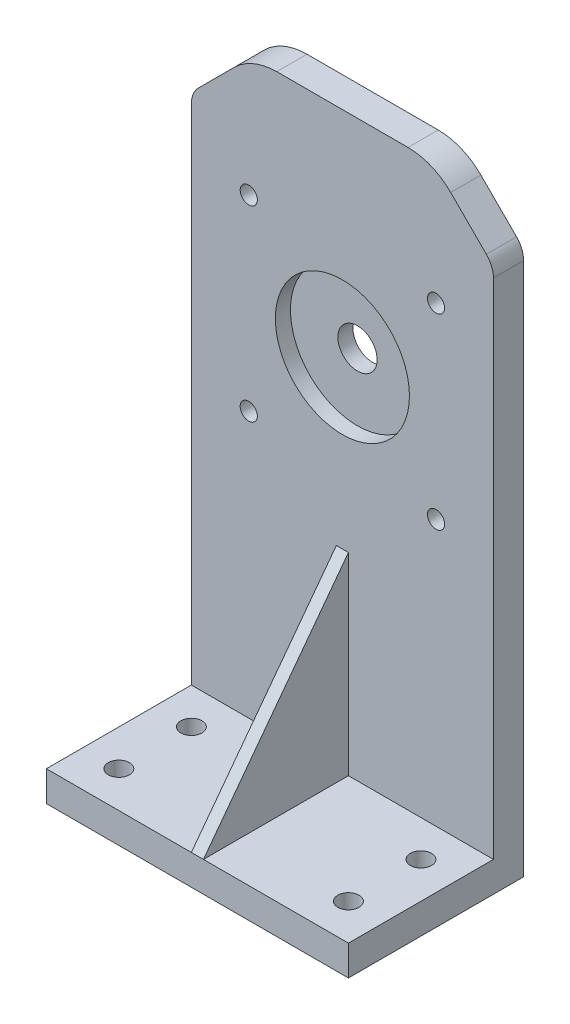
ISO-10303-21;
HEADER;
FILE_DESCRIPTION(('STEP AP214'),'2;1');
FILE_NAME('part.step','',(''),(''),'','','');
FILE_SCHEMA(('AUTOMOTIVE_DESIGN { 1 0 10303 214 1 1 1 1 }'));
ENDSEC;
DATA;
#1=APPLICATION_CONTEXT('core data for automotive mechanical design processes');
#2=APPLICATION_PROTOCOL_DEFINITION('international standard','automotive_design',2000,#1);
#3=PRODUCT_CONTEXT('',#1,'mechanical');
#4=PRODUCT('Part','Part','',(#3));
#5=PRODUCT_RELATED_PRODUCT_CATEGORY('part','',(#4));
#6=PRODUCT_DEFINITION_FORMATION('','',#4);
#7=PRODUCT_DEFINITION_CONTEXT('part definition',#1,'design');
#8=PRODUCT_DEFINITION('design','',#6,#7);
#9=PRODUCT_DEFINITION_SHAPE('','',#8);
#10=(LENGTH_UNIT() NAMED_UNIT(*) SI_UNIT(.MILLI.,.METRE.));
#11=(NAMED_UNIT(*) PLANE_ANGLE_UNIT() SI_UNIT($,.RADIAN.));
#12=(NAMED_UNIT(*) SI_UNIT($,.STERADIAN.) SOLID_ANGLE_UNIT());
#13=UNCERTAINTY_MEASURE_WITH_UNIT(LENGTH_MEASURE(1.E-05),#10,'distance_accuracy_value','');
#14=(GEOMETRIC_REPRESENTATION_CONTEXT(3) GLOBAL_UNCERTAINTY_ASSIGNED_CONTEXT((#13)) GLOBAL_UNIT_ASSIGNED_CONTEXT((#10,
#11,#12)) REPRESENTATION_CONTEXT('',''));
#15=CARTESIAN_POINT('',(0.,0.,0.));
#16=DIRECTION('',(0.,0.,1.));
#17=DIRECTION('',(1.,0.,0.));
#18=AXIS2_PLACEMENT_3D('',#15,#16,#17);
#19=CARTESIAN_POINT('',(0.,5.,0.));
#20=DIRECTION('',(0.,-1.,0.));
#21=DIRECTION('',(0.,0.,-1.));
#22=AXIS2_PLACEMENT_3D('',#19,#20,#21);
#23=PLANE('',#22);
#24=CARTESIAN_POINT('',(19.,5.,-3.5));
#25=DIRECTION('',(0.,1.,0.));
#26=DIRECTION('',(0.,0.,1.));
#27=AXIS2_PLACEMENT_3D('',#24,#25,#26);
#28=CIRCLE('',#27,1.75);
#29=CARTESIAN_POINT('',(19.,5.,-1.75));
#30=VERTEX_POINT('',#29);
#31=EDGE_CURVE('E287',#30,#30,#28,.T.);
#32=ORIENTED_EDGE('',*,*,#31,.F.);
#33=EDGE_LOOP('',(#32));
#34=FACE_BOUND('',#33,.T.);
#35=CARTESIAN_POINT('',(19.,5.,8.5));
#36=DIRECTION('',(0.,1.,0.));
#37=DIRECTION('',(0.,0.,1.));
#38=AXIS2_PLACEMENT_3D('',#35,#36,#37);
#39=CIRCLE('',#38,1.75);
#40=CARTESIAN_POINT('',(19.,5.,10.25));
#41=VERTEX_POINT('',#40);
#42=EDGE_CURVE('E290',#41,#41,#39,.T.);
#43=ORIENTED_EDGE('',*,*,#42,.F.);
#44=EDGE_LOOP('',(#43));
#45=FACE_BOUND('',#44,.T.);
#46=DIRECTION('',(0.,0.,-1.));
#47=VECTOR('',#46,1.);
#48=CARTESIAN_POINT('',(0.999999999999997,5.,-9.5));
#49=LINE('',#48,#47);
#50=CARTESIAN_POINT('',(1.,5.,14.5));
#51=VERTEX_POINT('',#50);
#52=CARTESIAN_POINT('',(0.999999999999997,5.,-9.5));
#53=VERTEX_POINT('',#52);
#54=EDGE_CURVE('E157',#51,#53,#49,.T.);
#55=ORIENTED_EDGE('',*,*,#54,.F.);
#56=DIRECTION('',(1.,0.,0.));
#57=VECTOR('',#56,1.);
#58=CARTESIAN_POINT('',(-25.,5.,14.5));
#59=LINE('',#58,#57);
#60=CARTESIAN_POINT('',(25.,5.,14.5));
#61=VERTEX_POINT('',#60);
#62=EDGE_CURVE('E163',#51,#61,#59,.T.);
#63=ORIENTED_EDGE('',*,*,#62,.T.);
#64=DIRECTION('',(0.,0.,-1.));
#65=VECTOR('',#64,1.);
#66=CARTESIAN_POINT('',(25.,5.,14.5));
#67=LINE('',#66,#65);
#68=CARTESIAN_POINT('',(25.,5.,-9.5));
#69=VERTEX_POINT('',#68);
#70=EDGE_CURVE('E176',#61,#69,#67,.T.);
#71=ORIENTED_EDGE('',*,*,#70,.T.);
#72=DIRECTION('',(1.,0.,0.));
#73=VECTOR('',#72,1.);
#74=CARTESIAN_POINT('',(-25.,5.,-9.5));
#75=LINE('',#74,#73);
#76=EDGE_CURVE('E166',#53,#69,#75,.T.);
#77=ORIENTED_EDGE('',*,*,#76,.F.);
#78=EDGE_LOOP('',(#55,#63,#71,#77));
#79=FACE_BOUND('',#78,.T.);
#80=ADVANCED_FACE('F35',(#34,#45,#79),#23,.F.);
#81=CARTESIAN_POINT('',(-19.,5.,-3.5));
#82=DIRECTION('',(0.,1.,0.));
#83=DIRECTION('',(0.,0.,1.));
#84=AXIS2_PLACEMENT_3D('',#81,#82,#83);
#85=CIRCLE('',#84,1.75);
#86=CARTESIAN_POINT('',(-19.,5.,-1.75));
#87=VERTEX_POINT('',#86);
#88=EDGE_CURVE('E204',#87,#87,#85,.T.);
#89=ORIENTED_EDGE('',*,*,#88,.F.);
#90=EDGE_LOOP('',(#89));
#91=FACE_BOUND('',#90,.T.);
#92=CARTESIAN_POINT('',(-19.,5.,8.5));
#93=DIRECTION('',(0.,1.,0.));
#94=DIRECTION('',(0.,0.,1.));
#95=AXIS2_PLACEMENT_3D('',#92,#93,#94);
#96=CIRCLE('',#95,1.75);
#97=CARTESIAN_POINT('',(-19.,5.,10.25));
#98=VERTEX_POINT('',#97);
#99=EDGE_CURVE('E209',#98,#98,#96,.T.);
#100=ORIENTED_EDGE('',*,*,#99,.F.);
#101=EDGE_LOOP('',(#100));
#102=FACE_BOUND('',#101,.T.);
#103=DIRECTION('',(0.,0.,1.));
#104=VECTOR('',#103,1.);
#105=CARTESIAN_POINT('',(-1.00000000000001,5.,-9.5));
#106=LINE('',#105,#104);
#107=CARTESIAN_POINT('',(-1.,5.,-9.5));
#108=VERTEX_POINT('',#107);
#109=CARTESIAN_POINT('',(-1.,5.,14.5));
#110=VERTEX_POINT('',#109);
#111=EDGE_CURVE('E167',#108,#110,#106,.T.);
#112=ORIENTED_EDGE('',*,*,#111,.F.);
#113=CARTESIAN_POINT('',(-25.,5.,-9.5));
#114=VERTEX_POINT('',#113);
#115=EDGE_CURVE('E336',#114,#108,#75,.T.);
#116=ORIENTED_EDGE('',*,*,#115,.F.);
#117=DIRECTION('',(0.,0.,1.));
#118=VECTOR('',#117,1.);
#119=CARTESIAN_POINT('',(-25.,5.,14.5));
#120=LINE('',#119,#118);
#121=CARTESIAN_POINT('',(-25.,5.,14.5));
#122=VERTEX_POINT('',#121);
#123=EDGE_CURVE('E174',#114,#122,#120,.T.);
#124=ORIENTED_EDGE('',*,*,#123,.T.);
#125=EDGE_CURVE('E173',#122,#110,#59,.T.);
#126=ORIENTED_EDGE('',*,*,#125,.T.);
#127=EDGE_LOOP('',(#112,#116,#124,#126));
#128=FACE_BOUND('',#127,.T.);
#129=ADVANCED_FACE('F273',(#91,#102,#128),#23,.F.);
#130=CARTESIAN_POINT('',(-25.,100.,-9.5));
#131=DIRECTION('',(0.,0.,-1.));
#132=DIRECTION('',(-1.,0.,0.));
#133=AXIS2_PLACEMENT_3D('',#130,#131,#132);
#134=PLANE('',#133);
#135=DIRECTION('',(-0.707106781186547,-0.707106781186549,0.));
#136=VECTOR('',#135,1.);
#137=CARTESIAN_POINT('',(-15.,100.,-9.5));
#138=LINE('',#137,#136);
#139=CARTESIAN_POINT('',(-17.9289321881345,97.0710678118655,-9.5));
#140=VERTEX_POINT('',#139);
#141=CARTESIAN_POINT('',(-23.8284271247462,91.1715728752538,-9.5));
#142=VERTEX_POINT('',#141);
#143=EDGE_CURVE('E216',#140,#142,#138,.T.);
#144=ORIENTED_EDGE('',*,*,#143,.T.);
#145=CARTESIAN_POINT('',(-21.,88.3431457505076,-9.5));
#146=DIRECTION('',(0.,0.,-1.));
#147=DIRECTION('',(-1.,0.,0.));
#148=AXIS2_PLACEMENT_3D('',#145,#146,#147);
#149=CIRCLE('',#148,4.);
#150=CARTESIAN_POINT('',(-25.,88.3431457505076,-9.5));
#151=VERTEX_POINT('',#150);
#152=EDGE_CURVE('E11',#142,#151,#149,.F.);
#153=ORIENTED_EDGE('',*,*,#152,.T.);
#154=DIRECTION('',(0.,-1.,0.));
#155=VECTOR('',#154,1.);
#156=CARTESIAN_POINT('',(-25.,100.,-9.5));
#157=LINE('',#156,#155);
#158=EDGE_CURVE('E184',#151,#114,#157,.T.);
#159=ORIENTED_EDGE('',*,*,#158,.T.);
#160=ORIENTED_EDGE('',*,*,#115,.T.);
#161=DIRECTION('',(0.,-1.,0.));
#162=VECTOR('',#161,1.);
#163=CARTESIAN_POINT('',(-1.00000000000001,37.,-9.5));
#164=LINE('',#163,#162);
#165=CARTESIAN_POINT('',(-1.00000000000001,37.,-9.5));
#166=VERTEX_POINT('',#165);
#167=EDGE_CURVE('E280',#166,#108,#164,.T.);
#168=ORIENTED_EDGE('',*,*,#167,.F.);
#169=DIRECTION('',(-1.,0.,0.));
#170=VECTOR('',#169,1.);
#171=CARTESIAN_POINT('',(0.999999999999997,37.,-9.5));
#172=LINE('',#171,#170);
#173=CARTESIAN_POINT('',(0.999999999999997,37.,-9.5));
#174=VERTEX_POINT('',#173);
#175=EDGE_CURVE('E281',#174,#166,#172,.T.);
#176=ORIENTED_EDGE('',*,*,#175,.F.);
#177=DIRECTION('',(0.,-1.,0.));
#178=VECTOR('',#177,1.);
#179=CARTESIAN_POINT('',(0.999999999999997,37.,-9.5));
#180=LINE('',#179,#178);
#181=EDGE_CURVE('E158',#174,#53,#180,.T.);
#182=ORIENTED_EDGE('',*,*,#181,.T.);
#183=ORIENTED_EDGE('',*,*,#76,.T.);
#184=DIRECTION('',(0.,-1.,0.));
#185=VECTOR('',#184,1.);
#186=CARTESIAN_POINT('',(25.,100.,-9.5));
#187=LINE('',#186,#185);
#188=CARTESIAN_POINT('',(25.,88.3431457505076,-9.5));
#189=VERTEX_POINT('',#188);
#190=EDGE_CURVE('E339',#189,#69,#187,.T.);
#191=ORIENTED_EDGE('',*,*,#190,.F.);
#192=CARTESIAN_POINT('',(21.,88.3431457505076,-9.5));
#193=DIRECTION('',(0.,0.,-1.));
#194=DIRECTION('',(-1.,0.,0.));
#195=AXIS2_PLACEMENT_3D('',#192,#193,#194);
#196=CIRCLE('',#195,4.);
#197=CARTESIAN_POINT('',(23.8284271247462,91.1715728752538,-9.5));
#198=VERTEX_POINT('',#197);
#199=EDGE_CURVE('E246',#189,#198,#196,.F.);
#200=ORIENTED_EDGE('',*,*,#199,.T.);
#201=DIRECTION('',(-0.707106781186547,0.707106781186549,0.));
#202=VECTOR('',#201,1.);
#203=CARTESIAN_POINT('',(15.,100.,-9.5));
#204=LINE('',#203,#202);
#205=CARTESIAN_POINT('',(17.9289321881345,97.0710678118655,-9.5));
#206=VERTEX_POINT('',#205);
#207=EDGE_CURVE('E199',#198,#206,#204,.T.);
#208=ORIENTED_EDGE('',*,*,#207,.T.);
#209=CARTESIAN_POINT('',(10.8578643762691,90.,-9.5));
#210=DIRECTION('',(0.,0.,-1.));
#211=DIRECTION('',(-1.,0.,0.));
#212=AXIS2_PLACEMENT_3D('',#209,#210,#211);
#213=CIRCLE('',#212,10.);
#214=CARTESIAN_POINT('',(10.8578643762691,100.,-9.5));
#215=VERTEX_POINT('',#214);
#216=EDGE_CURVE('E238',#206,#215,#213,.F.);
#217=ORIENTED_EDGE('',*,*,#216,.T.);
#218=DIRECTION('',(1.,0.,0.));
#219=VECTOR('',#218,1.);
#220=CARTESIAN_POINT('',(-25.,100.,-9.5));
#221=LINE('',#220,#219);
#222=CARTESIAN_POINT('',(-10.857864376269,100.,-9.5));
#223=VERTEX_POINT('',#222);
#224=EDGE_CURVE('E332',#223,#215,#221,.T.);
#225=ORIENTED_EDGE('',*,*,#224,.F.);
#226=CARTESIAN_POINT('',(-10.857864376269,90.,-9.5));
#227=DIRECTION('',(0.,0.,-1.));
#228=DIRECTION('',(-1.,0.,0.));
#229=AXIS2_PLACEMENT_3D('',#226,#227,#228);
#230=CIRCLE('',#229,10.);
#231=EDGE_CURVE('E236',#223,#140,#230,.F.);
#232=ORIENTED_EDGE('',*,*,#231,.T.);
#233=EDGE_LOOP('',(#144,#153,#159,#160,#168,#176,#182,#183,#191,#200,#208,#217,#225,#232));
#234=FACE_BOUND('',#233,.T.);
#235=CARTESIAN_POINT('',(0.,64.5,-9.5));
#236=DIRECTION('',(0.,0.,1.));
#237=DIRECTION('',(1.,0.,0.));
#238=AXIS2_PLACEMENT_3D('',#235,#236,#237);
#239=CIRCLE('',#238,11.1);
#240=CARTESIAN_POINT('',(11.1,64.5,-9.5));
#241=VERTEX_POINT('',#240);
#242=EDGE_CURVE('E302',#241,#241,#239,.T.);
#243=ORIENTED_EDGE('',*,*,#242,.F.);
#244=EDGE_LOOP('',(#243));
#245=FACE_BOUND('',#244,.T.);
#246=CARTESIAN_POINT('',(15.5,49.,-9.5));
#247=DIRECTION('',(0.,0.,1.));
#248=DIRECTION('',(1.,0.,0.));
#249=AXIS2_PLACEMENT_3D('',#246,#247,#248);
#250=CIRCLE('',#249,1.42);
#251=CARTESIAN_POINT('',(16.92,49.,-9.5));
#252=VERTEX_POINT('',#251);
#253=EDGE_CURVE('E309',#252,#252,#250,.T.);
#254=ORIENTED_EDGE('',*,*,#253,.F.);
#255=EDGE_LOOP('',(#254));
#256=FACE_BOUND('',#255,.T.);
#257=CARTESIAN_POINT('',(15.4999999999999,80.,-9.5));
#258=DIRECTION('',(0.,0.,1.));
#259=DIRECTION('',(1.,0.,0.));
#260=AXIS2_PLACEMENT_3D('',#257,#258,#259);
#261=CIRCLE('',#260,1.42);
#262=CARTESIAN_POINT('',(16.9199999999999,80.,-9.5));
#263=VERTEX_POINT('',#262);
#264=EDGE_CURVE('E313',#263,#263,#261,.T.);
#265=ORIENTED_EDGE('',*,*,#264,.F.);
#266=EDGE_LOOP('',(#265));
#267=FACE_BOUND('',#266,.T.);
#268=CARTESIAN_POINT('',(-15.5000000000001,80.,-9.5));
#269=DIRECTION('',(0.,0.,1.));
#270=DIRECTION('',(1.,0.,0.));
#271=AXIS2_PLACEMENT_3D('',#268,#269,#270);
#272=CIRCLE('',#271,1.42);
#273=CARTESIAN_POINT('',(-14.0800000000001,80.,-9.5));
#274=VERTEX_POINT('',#273);
#275=EDGE_CURVE('E306',#274,#274,#272,.T.);
#276=ORIENTED_EDGE('',*,*,#275,.F.);
#277=EDGE_LOOP('',(#276));
#278=FACE_BOUND('',#277,.T.);
#279=CARTESIAN_POINT('',(-15.5,49.,-9.5));
#280=DIRECTION('',(0.,0.,1.));
#281=DIRECTION('',(1.,0.,0.));
#282=AXIS2_PLACEMENT_3D('',#279,#280,#281);
#283=CIRCLE('',#282,1.42);
#284=CARTESIAN_POINT('',(-14.08,49.,-9.5));
#285=VERTEX_POINT('',#284);
#286=EDGE_CURVE('E326',#285,#285,#283,.T.);
#287=ORIENTED_EDGE('',*,*,#286,.F.);
#288=EDGE_LOOP('',(#287));
#289=FACE_BOUND('',#288,.T.);
#290=ADVANCED_FACE('F347',(#234,#245,#256,#267,#278,#289),#134,.F.);
#291=CARTESIAN_POINT('',(25.,5.,14.5));
#292=DIRECTION('',(-1.,0.,0.));
#293=DIRECTION('',(0.,0.,1.));
#294=AXIS2_PLACEMENT_3D('',#291,#292,#293);
#295=PLANE('',#294);
#296=DIRECTION('',(0.,-1.,0.));
#297=VECTOR('',#296,1.);
#298=CARTESIAN_POINT('',(25.,5.,-14.5));
#299=LINE('',#298,#297);
#300=CARTESIAN_POINT('',(25.,88.3431457505076,-14.5));
#301=VERTEX_POINT('',#300);
#302=CARTESIAN_POINT('',(25.,0.,-14.5));
#303=VERTEX_POINT('',#302);
#304=EDGE_CURVE('E197',#301,#303,#299,.T.);
#305=ORIENTED_EDGE('',*,*,#304,.F.);
#306=DIRECTION('',(0.,0.,1.));
#307=VECTOR('',#306,1.);
#308=CARTESIAN_POINT('',(25.,88.3431457505076,-9.5));
#309=LINE('',#308,#307);
#310=EDGE_CURVE('E243',#301,#189,#309,.T.);
#311=ORIENTED_EDGE('',*,*,#310,.T.);
#312=ORIENTED_EDGE('',*,*,#190,.T.);
#313=ORIENTED_EDGE('',*,*,#70,.F.);
#314=DIRECTION('',(0.,-1.,0.));
#315=VECTOR('',#314,1.);
#316=CARTESIAN_POINT('',(25.,5.,14.5));
#317=LINE('',#316,#315);
#318=CARTESIAN_POINT('',(25.,0.,14.5));
#319=VERTEX_POINT('',#318);
#320=EDGE_CURVE('E171',#61,#319,#317,.T.);
#321=ORIENTED_EDGE('',*,*,#320,.T.);
#322=DIRECTION('',(0.,0.,-1.));
#323=VECTOR('',#322,1.);
#324=CARTESIAN_POINT('',(25.,0.,14.5));
#325=LINE('',#324,#323);
#326=EDGE_CURVE('E180',#319,#303,#325,.T.);
#327=ORIENTED_EDGE('',*,*,#326,.T.);
#328=EDGE_LOOP('',(#305,#311,#312,#313,#321,#327));
#329=FACE_BOUND('',#328,.T.);
#330=ADVANCED_FACE('F343',(#329),#295,.F.);
#331=CARTESIAN_POINT('',(-25.,5.,-14.5));
#332=DIRECTION('',(0.,0.,1.));
#333=DIRECTION('',(1.,0.,0.));
#334=AXIS2_PLACEMENT_3D('',#331,#332,#333);
#335=PLANE('',#334);
#336=CARTESIAN_POINT('',(0.,64.5,-14.5));
#337=DIRECTION('',(0.,0.,1.));
#338=DIRECTION('',(1.,0.,0.));
#339=AXIS2_PLACEMENT_3D('',#336,#337,#338);
#340=CIRCLE('',#339,3.25);
#341=CARTESIAN_POINT('',(3.25,64.5,-14.5));
#342=VERTEX_POINT('',#341);
#343=EDGE_CURVE('E299',#342,#342,#340,.T.);
#344=ORIENTED_EDGE('',*,*,#343,.T.);
#345=EDGE_LOOP('',(#344));
#346=FACE_BOUND('',#345,.T.);
#347=CARTESIAN_POINT('',(15.5,49.,-14.5));
#348=DIRECTION('',(0.,0.,1.));
#349=DIRECTION('',(1.,0.,0.));
#350=AXIS2_PLACEMENT_3D('',#347,#348,#349);
#351=CIRCLE('',#350,1.42);
#352=CARTESIAN_POINT('',(16.92,49.,-14.5));
#353=VERTEX_POINT('',#352);
#354=EDGE_CURVE('E323',#353,#353,#351,.T.);
#355=ORIENTED_EDGE('',*,*,#354,.T.);
#356=EDGE_LOOP('',(#355));
#357=FACE_BOUND('',#356,.T.);
#358=CARTESIAN_POINT('',(15.4999999999999,80.,-14.5));
#359=DIRECTION('',(0.,0.,1.));
#360=DIRECTION('',(1.,0.,0.));
#361=AXIS2_PLACEMENT_3D('',#358,#359,#360);
#362=CIRCLE('',#361,1.42);
#363=CARTESIAN_POINT('',(16.9199999999999,80.,-14.5));
#364=VERTEX_POINT('',#363);
#365=EDGE_CURVE('E320',#364,#364,#362,.T.);
#366=ORIENTED_EDGE('',*,*,#365,.T.);
#367=EDGE_LOOP('',(#366));
#368=FACE_BOUND('',#367,.T.);
#369=CARTESIAN_POINT('',(-15.5000000000001,80.,-14.5));
#370=DIRECTION('',(0.,0.,1.));
#371=DIRECTION('',(1.,0.,0.));
#372=AXIS2_PLACEMENT_3D('',#369,#370,#371);
#373=CIRCLE('',#372,1.42);
#374=CARTESIAN_POINT('',(-14.0800000000001,80.,-14.5));
#375=VERTEX_POINT('',#374);
#376=EDGE_CURVE('E312',#375,#375,#373,.T.);
#377=ORIENTED_EDGE('',*,*,#376,.T.);
#378=EDGE_LOOP('',(#377));
#379=FACE_BOUND('',#378,.T.);
#380=CARTESIAN_POINT('',(-15.5,49.,-14.5));
#381=DIRECTION('',(0.,0.,1.));
#382=DIRECTION('',(1.,0.,0.));
#383=AXIS2_PLACEMENT_3D('',#380,#381,#382);
#384=CIRCLE('',#383,1.42);
#385=CARTESIAN_POINT('',(-14.08,49.,-14.5));
#386=VERTEX_POINT('',#385);
#387=EDGE_CURVE('E329',#386,#386,#384,.T.);
#388=ORIENTED_EDGE('',*,*,#387,.T.);
#389=EDGE_LOOP('',(#388));
#390=FACE_BOUND('',#389,.T.);
#391=DIRECTION('',(0.,-1.,0.));
#392=VECTOR('',#391,1.);
#393=CARTESIAN_POINT('',(-25.,5.,-14.5));
#394=LINE('',#393,#392);
#395=CARTESIAN_POINT('',(-25.,88.3431457505076,-14.5));
#396=VERTEX_POINT('',#395);
#397=CARTESIAN_POINT('',(-25.,0.,-14.5));
#398=VERTEX_POINT('',#397);
#399=EDGE_CURVE('E195',#396,#398,#394,.T.);
#400=ORIENTED_EDGE('',*,*,#399,.F.);
#401=CARTESIAN_POINT('',(-21.,88.3431457505076,-14.5));
#402=DIRECTION('',(0.,0.,1.));
#403=DIRECTION('',(1.,0.,0.));
#404=AXIS2_PLACEMENT_3D('',#401,#402,#403);
#405=CIRCLE('',#404,4.);
#406=CARTESIAN_POINT('',(-23.8284271247462,91.1715728752538,-14.5));
#407=VERTEX_POINT('',#406);
#408=EDGE_CURVE('E57',#396,#407,#405,.F.);
#409=ORIENTED_EDGE('',*,*,#408,.T.);
#410=DIRECTION('',(0.707106781186547,0.707106781186549,0.));
#411=VECTOR('',#410,1.);
#412=CARTESIAN_POINT('',(-15.,100.,-14.5));
#413=LINE('',#412,#411);
#414=CARTESIAN_POINT('',(-17.9289321881345,97.0710678118655,-14.5));
#415=VERTEX_POINT('',#414);
#416=EDGE_CURVE('E221',#407,#415,#413,.T.);
#417=ORIENTED_EDGE('',*,*,#416,.T.);
#418=CARTESIAN_POINT('',(-10.857864376269,90.,-14.5));
#419=DIRECTION('',(0.,0.,1.));
#420=DIRECTION('',(1.,0.,0.));
#421=AXIS2_PLACEMENT_3D('',#418,#419,#420);
#422=CIRCLE('',#421,10.);
#423=CARTESIAN_POINT('',(-10.857864376269,100.,-14.5));
#424=VERTEX_POINT('',#423);
#425=EDGE_CURVE('E229',#415,#424,#422,.F.);
#426=ORIENTED_EDGE('',*,*,#425,.T.);
#427=DIRECTION('',(-1.,0.,0.));
#428=VECTOR('',#427,1.);
#429=CARTESIAN_POINT('',(-25.,100.,-14.5));
#430=LINE('',#429,#428);
#431=CARTESIAN_POINT('',(10.8578643762691,100.,-14.5));
#432=VERTEX_POINT('',#431);
#433=EDGE_CURVE('E335',#432,#424,#430,.T.);
#434=ORIENTED_EDGE('',*,*,#433,.F.);
#435=CARTESIAN_POINT('',(10.8578643762691,90.,-14.5));
#436=DIRECTION('',(0.,0.,1.));
#437=DIRECTION('',(1.,0.,0.));
#438=AXIS2_PLACEMENT_3D('',#435,#436,#437);
#439=CIRCLE('',#438,10.);
#440=CARTESIAN_POINT('',(17.9289321881345,97.0710678118655,-14.5));
#441=VERTEX_POINT('',#440);
#442=EDGE_CURVE('E231',#432,#441,#439,.F.);
#443=ORIENTED_EDGE('',*,*,#442,.T.);
#444=DIRECTION('',(0.707106781186547,-0.707106781186549,0.));
#445=VECTOR('',#444,1.);
#446=CARTESIAN_POINT('',(15.,100.,-14.5));
#447=LINE('',#446,#445);
#448=CARTESIAN_POINT('',(23.8284271247462,91.1715728752538,-14.5));
#449=VERTEX_POINT('',#448);
#450=EDGE_CURVE('E218',#441,#449,#447,.T.);
#451=ORIENTED_EDGE('',*,*,#450,.T.);
#452=CARTESIAN_POINT('',(21.,88.3431457505076,-14.5));
#453=DIRECTION('',(0.,0.,1.));
#454=DIRECTION('',(1.,0.,0.));
#455=AXIS2_PLACEMENT_3D('',#452,#453,#454);
#456=CIRCLE('',#455,4.);
#457=EDGE_CURVE('E250',#449,#301,#456,.F.);
#458=ORIENTED_EDGE('',*,*,#457,.T.);
#459=ORIENTED_EDGE('',*,*,#304,.T.);
#460=DIRECTION('',(-1.,0.,0.));
#461=VECTOR('',#460,1.);
#462=CARTESIAN_POINT('',(-25.,0.,-14.5));
#463=LINE('',#462,#461);
#464=EDGE_CURVE('E183',#303,#398,#463,.T.);
#465=ORIENTED_EDGE('',*,*,#464,.T.);
#466=EDGE_LOOP('',(#400,#409,#417,#426,#434,#443,#451,#458,#459,#465));
#467=FACE_BOUND('',#466,.T.);
#468=ADVANCED_FACE('F262',(#346,#357,#368,#379,#390,#467),#335,.F.);
#469=CARTESIAN_POINT('',(-25.,5.,14.5));
#470=DIRECTION('',(1.,0.,0.));
#471=DIRECTION('',(0.,0.,-1.));
#472=AXIS2_PLACEMENT_3D('',#469,#470,#471);
#473=PLANE('',#472);
#474=ORIENTED_EDGE('',*,*,#158,.F.);
#475=DIRECTION('',(0.,0.,-1.));
#476=VECTOR('',#475,1.);
#477=CARTESIAN_POINT('',(-25.,88.3431457505076,-14.5));
#478=LINE('',#477,#476);
#479=EDGE_CURVE('E252',#151,#396,#478,.T.);
#480=ORIENTED_EDGE('',*,*,#479,.T.);
#481=ORIENTED_EDGE('',*,*,#399,.T.);
#482=DIRECTION('',(0.,0.,1.));
#483=VECTOR('',#482,1.);
#484=CARTESIAN_POINT('',(-25.,0.,14.5));
#485=LINE('',#484,#483);
#486=CARTESIAN_POINT('',(-25.,0.,14.5));
#487=VERTEX_POINT('',#486);
#488=EDGE_CURVE('E187',#398,#487,#485,.T.);
#489=ORIENTED_EDGE('',*,*,#488,.T.);
#490=DIRECTION('',(0.,-1.,0.));
#491=VECTOR('',#490,1.);
#492=CARTESIAN_POINT('',(-25.,5.,14.5));
#493=LINE('',#492,#491);
#494=EDGE_CURVE('E192',#122,#487,#493,.T.);
#495=ORIENTED_EDGE('',*,*,#494,.F.);
#496=ORIENTED_EDGE('',*,*,#123,.F.);
#497=EDGE_LOOP('',(#474,#480,#481,#489,#495,#496));
#498=FACE_BOUND('',#497,.T.);
#499=ADVANCED_FACE('F258',(#498),#473,.F.);
#500=CARTESIAN_POINT('',(-25.,5.,14.5));
#501=DIRECTION('',(0.,0.,-1.));
#502=DIRECTION('',(-1.,0.,0.));
#503=AXIS2_PLACEMENT_3D('',#500,#501,#502);
#504=PLANE('',#503);
#505=ORIENTED_EDGE('',*,*,#62,.F.);
#506=DIRECTION('',(1.,0.,0.));
#507=VECTOR('',#506,1.);
#508=CARTESIAN_POINT('',(-34.,5.,14.5));
#509=LINE('',#508,#507);
#510=EDGE_CURVE('E140',#110,#51,#509,.T.);
#511=ORIENTED_EDGE('',*,*,#510,.F.);
#512=ORIENTED_EDGE('',*,*,#125,.F.);
#513=ORIENTED_EDGE('',*,*,#494,.T.);
#514=DIRECTION('',(1.,0.,0.));
#515=VECTOR('',#514,1.);
#516=CARTESIAN_POINT('',(-25.,0.,14.5));
#517=LINE('',#516,#515);
#518=EDGE_CURVE('E189',#487,#319,#517,.T.);
#519=ORIENTED_EDGE('',*,*,#518,.T.);
#520=ORIENTED_EDGE('',*,*,#320,.F.);
#521=EDGE_LOOP('',(#505,#511,#512,#513,#519,#520));
#522=FACE_BOUND('',#521,.T.);
#523=ADVANCED_FACE('F169',(#522),#504,.F.);
#524=CARTESIAN_POINT('',(0.,0.,0.));
#525=DIRECTION('',(0.,-1.,0.));
#526=DIRECTION('',(0.,0.,-1.));
#527=AXIS2_PLACEMENT_3D('',#524,#525,#526);
#528=PLANE('',#527);
#529=CARTESIAN_POINT('',(-19.,0.,8.5));
#530=DIRECTION('',(0.,-1.,0.));
#531=DIRECTION('',(0.,0.,-1.));
#532=AXIS2_PLACEMENT_3D('',#529,#530,#531);
#533=CIRCLE('',#532,1.75);
#534=CARTESIAN_POINT('',(-19.,0.,6.75));
#535=VERTEX_POINT('',#534);
#536=EDGE_CURVE('E212',#535,#535,#533,.T.);
#537=ORIENTED_EDGE('',*,*,#536,.F.);
#538=EDGE_LOOP('',(#537));
#539=FACE_BOUND('',#538,.T.);
#540=CARTESIAN_POINT('',(19.,0.,8.5));
#541=DIRECTION('',(0.,-1.,0.));
#542=DIRECTION('',(0.,0.,-1.));
#543=AXIS2_PLACEMENT_3D('',#540,#541,#542);
#544=CIRCLE('',#543,1.75);
#545=CARTESIAN_POINT('',(19.,0.,6.75));
#546=VERTEX_POINT('',#545);
#547=EDGE_CURVE('E208',#546,#546,#544,.T.);
#548=ORIENTED_EDGE('',*,*,#547,.F.);
#549=EDGE_LOOP('',(#548));
#550=FACE_BOUND('',#549,.T.);
#551=CARTESIAN_POINT('',(19.,0.,-3.5));
#552=DIRECTION('',(0.,-1.,0.));
#553=DIRECTION('',(0.,0.,-1.));
#554=AXIS2_PLACEMENT_3D('',#551,#552,#553);
#555=CIRCLE('',#554,1.75);
#556=CARTESIAN_POINT('',(19.,0.,-5.25));
#557=VERTEX_POINT('',#556);
#558=EDGE_CURVE('E205',#557,#557,#555,.T.);
#559=ORIENTED_EDGE('',*,*,#558,.F.);
#560=EDGE_LOOP('',(#559));
#561=FACE_BOUND('',#560,.T.);
#562=CARTESIAN_POINT('',(-19.,0.,-3.5));
#563=DIRECTION('',(0.,-1.,0.));
#564=DIRECTION('',(0.,0.,-1.));
#565=AXIS2_PLACEMENT_3D('',#562,#563,#564);
#566=CIRCLE('',#565,1.75);
#567=CARTESIAN_POINT('',(-19.,0.,-5.25));
#568=VERTEX_POINT('',#567);
#569=EDGE_CURVE('E200',#568,#568,#566,.T.);
#570=ORIENTED_EDGE('',*,*,#569,.F.);
#571=EDGE_LOOP('',(#570));
#572=FACE_BOUND('',#571,.T.);
#573=ORIENTED_EDGE('',*,*,#326,.F.);
#574=ORIENTED_EDGE('',*,*,#518,.F.);
#575=ORIENTED_EDGE('',*,*,#488,.F.);
#576=ORIENTED_EDGE('',*,*,#464,.F.);
#577=EDGE_LOOP('',(#573,#574,#575,#576));
#578=FACE_BOUND('',#577,.T.);
#579=ADVANCED_FACE('F269',(#539,#550,#561,#572,#578),#528,.T.);
#580=CARTESIAN_POINT('',(0.,100.,0.));
#581=DIRECTION('',(0.,1.,0.));
#582=DIRECTION('',(0.,0.,1.));
#583=AXIS2_PLACEMENT_3D('',#580,#581,#582);
#584=PLANE('',#583);
#585=ORIENTED_EDGE('',*,*,#224,.T.);
#586=DIRECTION('',(0.,0.,-1.));
#587=VECTOR('',#586,1.);
#588=CARTESIAN_POINT('',(10.8578643762691,100.,0.));
#589=LINE('',#588,#587);
#590=EDGE_CURVE('E226',#215,#432,#589,.T.);
#591=ORIENTED_EDGE('',*,*,#590,.T.);
#592=ORIENTED_EDGE('',*,*,#433,.T.);
#593=DIRECTION('',(0.,0.,1.));
#594=VECTOR('',#593,1.);
#595=CARTESIAN_POINT('',(-10.857864376269,100.,0.));
#596=LINE('',#595,#594);
#597=EDGE_CURVE('E223',#424,#223,#596,.T.);
#598=ORIENTED_EDGE('',*,*,#597,.T.);
#599=EDGE_LOOP('',(#585,#591,#592,#598));
#600=FACE_BOUND('',#599,.T.);
#601=ADVANCED_FACE('F370',(#600),#584,.T.);
#602=CARTESIAN_POINT('',(-15.5,49.,-69.5));
#603=DIRECTION('',(0.,0.,1.));
#604=DIRECTION('',(1.,0.,0.));
#605=AXIS2_PLACEMENT_3D('',#602,#603,#604);
#606=CYLINDRICAL_SURFACE('',#605,1.42);
#607=ORIENTED_EDGE('',*,*,#286,.T.);
#608=EDGE_LOOP('',(#607));
#609=FACE_BOUND('',#608,.T.);
#610=ORIENTED_EDGE('',*,*,#387,.F.);
#611=EDGE_LOOP('',(#610));
#612=FACE_BOUND('',#611,.T.);
#613=ADVANCED_FACE('F410',(#609,#612),#606,.F.);
#614=CARTESIAN_POINT('',(-15.5000000000001,80.,-69.5));
#615=DIRECTION('',(0.,0.,1.));
#616=DIRECTION('',(1.,0.,0.));
#617=AXIS2_PLACEMENT_3D('',#614,#615,#616);
#618=CYLINDRICAL_SURFACE('',#617,1.42);
#619=ORIENTED_EDGE('',*,*,#275,.T.);
#620=EDGE_LOOP('',(#619));
#621=FACE_BOUND('',#620,.T.);
#622=ORIENTED_EDGE('',*,*,#376,.F.);
#623=EDGE_LOOP('',(#622));
#624=FACE_BOUND('',#623,.T.);
#625=ADVANCED_FACE('F414',(#621,#624),#618,.F.);
#626=CARTESIAN_POINT('',(15.4999999999999,80.,-69.5));
#627=DIRECTION('',(0.,0.,1.));
#628=DIRECTION('',(1.,0.,0.));
#629=AXIS2_PLACEMENT_3D('',#626,#627,#628);
#630=CYLINDRICAL_SURFACE('',#629,1.42);
#631=ORIENTED_EDGE('',*,*,#264,.T.);
#632=EDGE_LOOP('',(#631));
#633=FACE_BOUND('',#632,.T.);
#634=ORIENTED_EDGE('',*,*,#365,.F.);
#635=EDGE_LOOP('',(#634));
#636=FACE_BOUND('',#635,.T.);
#637=ADVANCED_FACE('F420',(#633,#636),#630,.F.);
#638=CARTESIAN_POINT('',(15.5,49.,-69.5));
#639=DIRECTION('',(0.,0.,1.));
#640=DIRECTION('',(1.,0.,0.));
#641=AXIS2_PLACEMENT_3D('',#638,#639,#640);
#642=CYLINDRICAL_SURFACE('',#641,1.42);
#643=ORIENTED_EDGE('',*,*,#253,.T.);
#644=EDGE_LOOP('',(#643));
#645=FACE_BOUND('',#644,.T.);
#646=ORIENTED_EDGE('',*,*,#354,.F.);
#647=EDGE_LOOP('',(#646));
#648=FACE_BOUND('',#647,.T.);
#649=ADVANCED_FACE('F424',(#645,#648),#642,.F.);
#650=CARTESIAN_POINT('',(0.,64.5,-12.));
#651=DIRECTION('',(0.,0.,1.));
#652=DIRECTION('',(1.,0.,0.));
#653=AXIS2_PLACEMENT_3D('',#650,#651,#652);
#654=CYLINDRICAL_SURFACE('',#653,11.1);
#655=CARTESIAN_POINT('',(0.,64.5,-12.));
#656=DIRECTION('',(0.,0.,1.));
#657=DIRECTION('',(1.,0.,0.));
#658=AXIS2_PLACEMENT_3D('',#655,#656,#657);
#659=CIRCLE('',#658,11.1);
#660=CARTESIAN_POINT('',(11.1,64.5,-12.));
#661=VERTEX_POINT('',#660);
#662=EDGE_CURVE('E303',#661,#661,#659,.T.);
#663=ORIENTED_EDGE('',*,*,#662,.F.);
#664=EDGE_LOOP('',(#663));
#665=FACE_BOUND('',#664,.T.);
#666=ORIENTED_EDGE('',*,*,#242,.T.);
#667=EDGE_LOOP('',(#666));
#668=FACE_BOUND('',#667,.T.);
#669=ADVANCED_FACE('F428',(#665,#668),#654,.F.);
#670=CARTESIAN_POINT('',(0.,64.5,-12.));
#671=DIRECTION('',(0.,0.,1.));
#672=DIRECTION('',(1.,0.,0.));
#673=AXIS2_PLACEMENT_3D('',#670,#671,#672);
#674=PLANE('',#673);
#675=CARTESIAN_POINT('',(0.,64.5,-12.));
#676=DIRECTION('',(0.,0.,1.));
#677=DIRECTION('',(1.,0.,0.));
#678=AXIS2_PLACEMENT_3D('',#675,#676,#677);
#679=CIRCLE('',#678,3.25);
#680=CARTESIAN_POINT('',(3.25,64.5,-12.));
#681=VERTEX_POINT('',#680);
#682=EDGE_CURVE('E203',#681,#681,#679,.T.);
#683=ORIENTED_EDGE('',*,*,#682,.F.);
#684=EDGE_LOOP('',(#683));
#685=FACE_BOUND('',#684,.T.);
#686=ORIENTED_EDGE('',*,*,#662,.T.);
#687=EDGE_LOOP('',(#686));
#688=FACE_BOUND('',#687,.T.);
#689=ADVANCED_FACE('F432',(#685,#688),#674,.T.);
#690=CARTESIAN_POINT('',(0.,64.5,-22.));
#691=DIRECTION('',(0.,0.,1.));
#692=DIRECTION('',(1.,0.,0.));
#693=AXIS2_PLACEMENT_3D('',#690,#691,#692);
#694=CYLINDRICAL_SURFACE('',#693,3.25);
#695=ORIENTED_EDGE('',*,*,#682,.T.);
#696=EDGE_LOOP('',(#695));
#697=FACE_BOUND('',#696,.T.);
#698=ORIENTED_EDGE('',*,*,#343,.F.);
#699=EDGE_LOOP('',(#698));
#700=FACE_BOUND('',#699,.T.);
#701=ADVANCED_FACE('F436',(#697,#700),#694,.F.);
#702=CARTESIAN_POINT('',(-19.,-5.,-3.5));
#703=DIRECTION('',(0.,1.,0.));
#704=DIRECTION('',(0.,0.,1.));
#705=AXIS2_PLACEMENT_3D('',#702,#703,#704);
#706=CYLINDRICAL_SURFACE('',#705,1.75);
#707=ORIENTED_EDGE('',*,*,#569,.T.);
#708=EDGE_LOOP('',(#707));
#709=FACE_BOUND('',#708,.T.);
#710=ORIENTED_EDGE('',*,*,#88,.T.);
#711=EDGE_LOOP('',(#710));
#712=FACE_BOUND('',#711,.T.);
#713=ADVANCED_FACE('F440',(#709,#712),#706,.F.);
#714=CARTESIAN_POINT('',(19.,-5.,-3.5));
#715=DIRECTION('',(0.,1.,0.));
#716=DIRECTION('',(0.,0.,1.));
#717=AXIS2_PLACEMENT_3D('',#714,#715,#716);
#718=CYLINDRICAL_SURFACE('',#717,1.75);
#719=ORIENTED_EDGE('',*,*,#558,.T.);
#720=EDGE_LOOP('',(#719));
#721=FACE_BOUND('',#720,.T.);
#722=ORIENTED_EDGE('',*,*,#31,.T.);
#723=EDGE_LOOP('',(#722));
#724=FACE_BOUND('',#723,.T.);
#725=ADVANCED_FACE('F444',(#721,#724),#718,.F.);
#726=CARTESIAN_POINT('',(19.,-5.,8.5));
#727=DIRECTION('',(0.,1.,0.));
#728=DIRECTION('',(0.,0.,1.));
#729=AXIS2_PLACEMENT_3D('',#726,#727,#728);
#730=CYLINDRICAL_SURFACE('',#729,1.75);
#731=ORIENTED_EDGE('',*,*,#547,.T.);
#732=EDGE_LOOP('',(#731));
#733=FACE_BOUND('',#732,.T.);
#734=ORIENTED_EDGE('',*,*,#42,.T.);
#735=EDGE_LOOP('',(#734));
#736=FACE_BOUND('',#735,.T.);
#737=ADVANCED_FACE('F448',(#733,#736),#730,.F.);
#738=CARTESIAN_POINT('',(-19.,-5.,8.5));
#739=DIRECTION('',(0.,1.,0.));
#740=DIRECTION('',(0.,0.,1.));
#741=AXIS2_PLACEMENT_3D('',#738,#739,#740);
#742=CYLINDRICAL_SURFACE('',#741,1.75);
#743=ORIENTED_EDGE('',*,*,#536,.T.);
#744=EDGE_LOOP('',(#743));
#745=FACE_BOUND('',#744,.T.);
#746=ORIENTED_EDGE('',*,*,#99,.T.);
#747=EDGE_LOOP('',(#746));
#748=FACE_BOUND('',#747,.T.);
#749=ADVANCED_FACE('F452',(#745,#748),#742,.F.);
#750=CARTESIAN_POINT('',(0.999999999999997,37.,-9.5));
#751=DIRECTION('',(-1.,0.,0.));
#752=DIRECTION('',(0.,0.,1.));
#753=AXIS2_PLACEMENT_3D('',#750,#751,#752);
#754=PLANE('',#753);
#755=ORIENTED_EDGE('',*,*,#181,.F.);
#756=DIRECTION('',(0.,0.8,-0.6));
#757=VECTOR('',#756,1.);
#758=CARTESIAN_POINT('',(0.999999999999997,37.,-9.5));
#759=LINE('',#758,#757);
#760=EDGE_CURVE('E143',#51,#174,#759,.T.);
#761=ORIENTED_EDGE('',*,*,#760,.F.);
#762=ORIENTED_EDGE('',*,*,#54,.T.);
#763=EDGE_LOOP('',(#755,#761,#762));
#764=FACE_BOUND('',#763,.T.);
#765=ADVANCED_FACE('F156',(#764),#754,.F.);
#766=CARTESIAN_POINT('',(-1.00000000000001,37.,-9.5));
#767=DIRECTION('',(1.,0.,0.));
#768=DIRECTION('',(0.,0.,-1.));
#769=AXIS2_PLACEMENT_3D('',#766,#767,#768);
#770=PLANE('',#769);
#771=ORIENTED_EDGE('',*,*,#111,.T.);
#772=DIRECTION('',(0.,0.8,-0.6));
#773=VECTOR('',#772,1.);
#774=CARTESIAN_POINT('',(-1.00000000000001,37.,-9.5));
#775=LINE('',#774,#773);
#776=EDGE_CURVE('E146',#110,#166,#775,.T.);
#777=ORIENTED_EDGE('',*,*,#776,.T.);
#778=ORIENTED_EDGE('',*,*,#167,.T.);
#779=EDGE_LOOP('',(#771,#777,#778));
#780=FACE_BOUND('',#779,.T.);
#781=ADVANCED_FACE('F278',(#780),#770,.F.);
#782=CARTESIAN_POINT('',(-34.,37.,-9.49999999999999));
#783=DIRECTION('',(0.,-0.6,-0.8));
#784=DIRECTION('',(0.,0.8,-0.6));
#785=AXIS2_PLACEMENT_3D('',#782,#783,#784);
#786=PLANE('',#785);
#787=ORIENTED_EDGE('',*,*,#510,.T.);
#788=ORIENTED_EDGE('',*,*,#760,.T.);
#789=ORIENTED_EDGE('',*,*,#175,.T.);
#790=ORIENTED_EDGE('',*,*,#776,.F.);
#791=EDGE_LOOP('',(#787,#788,#789,#790));
#792=FACE_BOUND('',#791,.T.);
#793=ADVANCED_FACE('F142',(#792),#786,.F.);
#794=CARTESIAN_POINT('',(-15.,100.,0.));
#795=DIRECTION('',(-0.707106781186548,0.707106781186546,0.));
#796=DIRECTION('',(0.,0.,-1.));
#797=AXIS2_PLACEMENT_3D('',#794,#795,#796);
#798=PLANE('',#797);
#799=ORIENTED_EDGE('',*,*,#416,.F.);
#800=DIRECTION('',(0.,0.,-1.));
#801=VECTOR('',#800,1.);
#802=CARTESIAN_POINT('',(-23.8284271247462,91.1715728752538,-9.5));
#803=LINE('',#802,#801);
#804=EDGE_CURVE('E43',#407,#142,#803,.F.);
#805=ORIENTED_EDGE('',*,*,#804,.T.);
#806=ORIENTED_EDGE('',*,*,#143,.F.);
#807=DIRECTION('',(0.,0.,1.));
#808=VECTOR('',#807,1.);
#809=CARTESIAN_POINT('',(-17.9289321881345,97.0710678118655,0.));
#810=LINE('',#809,#808);
#811=EDGE_CURVE('E240',#140,#415,#810,.F.);
#812=ORIENTED_EDGE('',*,*,#811,.T.);
#813=EDGE_LOOP('',(#799,#805,#806,#812));
#814=FACE_BOUND('',#813,.T.);
#815=ADVANCED_FACE('F381',(#814),#798,.T.);
#816=CARTESIAN_POINT('',(15.,100.,0.));
#817=DIRECTION('',(0.707106781186548,0.707106781186546,0.));
#818=DIRECTION('',(0.,0.,1.));
#819=AXIS2_PLACEMENT_3D('',#816,#817,#818);
#820=PLANE('',#819);
#821=ORIENTED_EDGE('',*,*,#207,.F.);
#822=DIRECTION('',(0.,0.,1.));
#823=VECTOR('',#822,1.);
#824=CARTESIAN_POINT('',(23.8284271247462,91.1715728752538,-14.5));
#825=LINE('',#824,#823);
#826=EDGE_CURVE('E248',#198,#449,#825,.F.);
#827=ORIENTED_EDGE('',*,*,#826,.T.);
#828=ORIENTED_EDGE('',*,*,#450,.F.);
#829=DIRECTION('',(0.,0.,-1.));
#830=VECTOR('',#829,1.);
#831=CARTESIAN_POINT('',(17.9289321881345,97.0710678118655,0.));
#832=LINE('',#831,#830);
#833=EDGE_CURVE('E233',#441,#206,#832,.F.);
#834=ORIENTED_EDGE('',*,*,#833,.T.);
#835=EDGE_LOOP('',(#821,#827,#828,#834));
#836=FACE_BOUND('',#835,.T.);
#837=ADVANCED_FACE('F384',(#836),#820,.T.);
#838=CARTESIAN_POINT('',(10.8578643762691,90.,0.));
#839=DIRECTION('',(0.,0.,-1.));
#840=DIRECTION('',(-1.,0.,0.));
#841=AXIS2_PLACEMENT_3D('',#838,#839,#840);
#842=CYLINDRICAL_SURFACE('',#841,10.);
#843=ORIENTED_EDGE('',*,*,#216,.F.);
#844=ORIENTED_EDGE('',*,*,#833,.F.);
#845=ORIENTED_EDGE('',*,*,#442,.F.);
#846=ORIENTED_EDGE('',*,*,#590,.F.);
#847=EDGE_LOOP('',(#843,#844,#845,#846));
#848=FACE_BOUND('',#847,.T.);
#849=ADVANCED_FACE('F387',(#848),#842,.T.);
#850=CARTESIAN_POINT('',(-10.857864376269,90.,0.));
#851=DIRECTION('',(0.,0.,1.));
#852=DIRECTION('',(1.,0.,0.));
#853=AXIS2_PLACEMENT_3D('',#850,#851,#852);
#854=CYLINDRICAL_SURFACE('',#853,10.);
#855=ORIENTED_EDGE('',*,*,#425,.F.);
#856=ORIENTED_EDGE('',*,*,#811,.F.);
#857=ORIENTED_EDGE('',*,*,#231,.F.);
#858=ORIENTED_EDGE('',*,*,#597,.F.);
#859=EDGE_LOOP('',(#855,#856,#857,#858));
#860=FACE_BOUND('',#859,.T.);
#861=ADVANCED_FACE('F354',(#860),#854,.T.);
#862=CARTESIAN_POINT('',(21.,88.3431457505076,14.5));
#863=DIRECTION('',(0.,0.,-1.));
#864=DIRECTION('',(-1.,0.,0.));
#865=AXIS2_PLACEMENT_3D('',#862,#863,#864);
#866=CYLINDRICAL_SURFACE('',#865,4.);
#867=ORIENTED_EDGE('',*,*,#457,.F.);
#868=ORIENTED_EDGE('',*,*,#826,.F.);
#869=ORIENTED_EDGE('',*,*,#199,.F.);
#870=ORIENTED_EDGE('',*,*,#310,.F.);
#871=EDGE_LOOP('',(#867,#868,#869,#870));
#872=FACE_BOUND('',#871,.T.);
#873=ADVANCED_FACE('F350',(#872),#866,.T.);
#874=CARTESIAN_POINT('',(-21.,88.3431457505076,14.5));
#875=DIRECTION('',(0.,0.,1.));
#876=DIRECTION('',(1.,0.,0.));
#877=AXIS2_PLACEMENT_3D('',#874,#875,#876);
#878=CYLINDRICAL_SURFACE('',#877,4.);
#879=ORIENTED_EDGE('',*,*,#152,.F.);
#880=ORIENTED_EDGE('',*,*,#804,.F.);
#881=ORIENTED_EDGE('',*,*,#408,.F.);
#882=ORIENTED_EDGE('',*,*,#479,.F.);
#883=EDGE_LOOP('',(#879,#880,#881,#882));
#884=FACE_BOUND('',#883,.T.);
#885=ADVANCED_FACE('F37',(#884),#878,.T.);
#886=CLOSED_SHELL('',(#80,#129,#290,#330,#468,#499,#523,#579,#601,#613,#625,#637,#649,#669,#689,
#701,#713,#725,#737,#749,#765,#781,#793,#815,#837,#849,#861,#873,#885));
#887=MANIFOLD_SOLID_BREP('B2',#886);
#888=ADVANCED_BREP_SHAPE_REPRESENTATION('',(#18,#887),#14);
#889=SHAPE_DEFINITION_REPRESENTATION(#9,#888);
ENDSEC;
END-ISO-10303-21;
